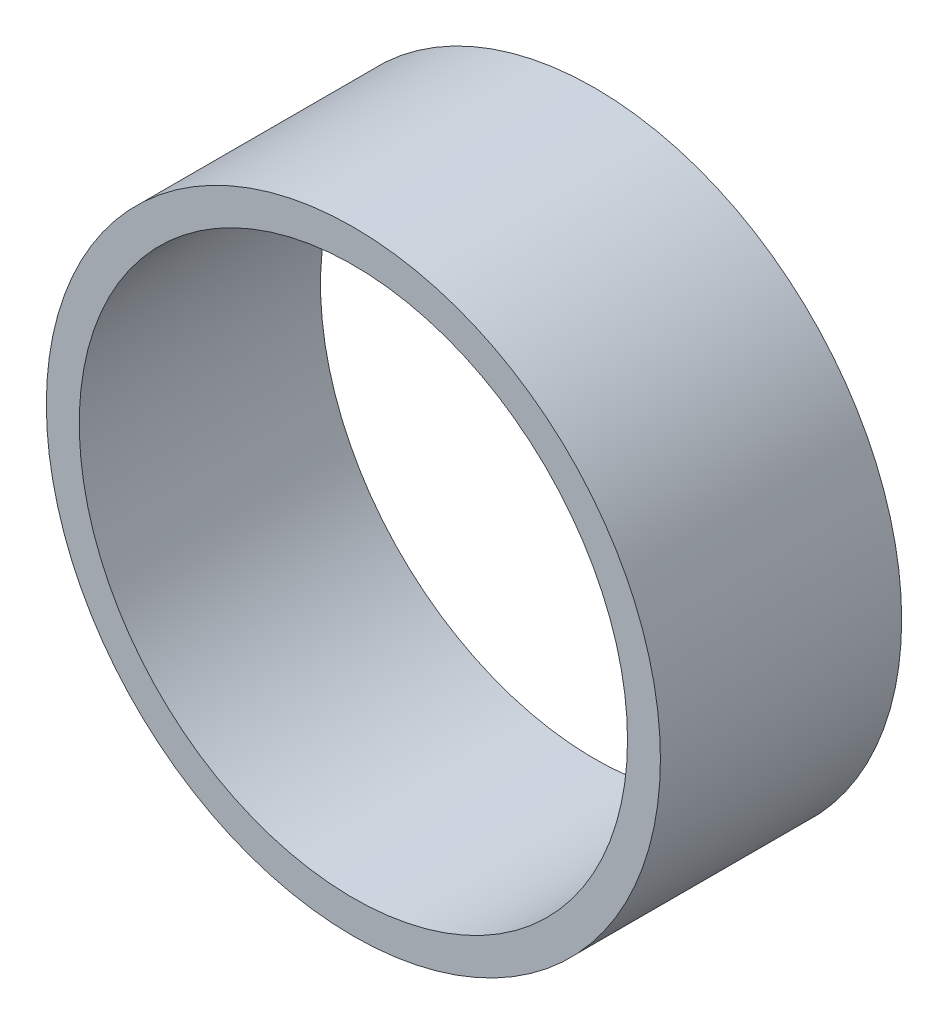
ISO-10303-21;
HEADER;
FILE_DESCRIPTION(('STEP AP214'),'2;1');
FILE_NAME('part.step','',(''),(''),'','','');
FILE_SCHEMA(('AUTOMOTIVE_DESIGN { 1 0 10303 214 1 1 1 1 }'));
ENDSEC;
DATA;
#1=APPLICATION_CONTEXT('core data for automotive mechanical design processes');
#2=APPLICATION_PROTOCOL_DEFINITION('international standard','automotive_design',2000,#1);
#3=PRODUCT_CONTEXT('',#1,'mechanical');
#4=PRODUCT('Part','Part','',(#3));
#5=PRODUCT_RELATED_PRODUCT_CATEGORY('part','',(#4));
#6=PRODUCT_DEFINITION_FORMATION('','',#4);
#7=PRODUCT_DEFINITION_CONTEXT('part definition',#1,'design');
#8=PRODUCT_DEFINITION('design','',#6,#7);
#9=PRODUCT_DEFINITION_SHAPE('','',#8);
#10=(LENGTH_UNIT() NAMED_UNIT(*) SI_UNIT(.MILLI.,.METRE.));
#11=(NAMED_UNIT(*) PLANE_ANGLE_UNIT() SI_UNIT($,.RADIAN.));
#12=(NAMED_UNIT(*) SI_UNIT($,.STERADIAN.) SOLID_ANGLE_UNIT());
#13=UNCERTAINTY_MEASURE_WITH_UNIT(LENGTH_MEASURE(1.E-05),#10,'distance_accuracy_value','');
#14=(GEOMETRIC_REPRESENTATION_CONTEXT(3) GLOBAL_UNCERTAINTY_ASSIGNED_CONTEXT((#13)) GLOBAL_UNIT_ASSIGNED_CONTEXT((#10,
#11,#12)) REPRESENTATION_CONTEXT('',''));
#15=CARTESIAN_POINT('',(0.,0.,0.));
#16=DIRECTION('',(0.,0.,1.));
#17=DIRECTION('',(1.,0.,0.));
#18=AXIS2_PLACEMENT_3D('',#15,#16,#17);
#19=CARTESIAN_POINT('',(0.,0.,22.));
#20=DIRECTION('',(0.,0.,1.));
#21=DIRECTION('',(1.,0.,0.));
#22=AXIS2_PLACEMENT_3D('',#19,#20,#21);
#23=PLANE('',#22);
#24=CARTESIAN_POINT('',(0.,0.,22.));
#25=DIRECTION('',(0.,0.,1.));
#26=DIRECTION('',(1.,0.,0.));
#27=AXIS2_PLACEMENT_3D('',#24,#25,#26);
#28=CIRCLE('',#27,28.);
#29=CARTESIAN_POINT('',(28.,0.,22.));
#30=VERTEX_POINT('',#29);
#31=EDGE_CURVE('E12',#30,#30,#28,.T.);
#32=ORIENTED_EDGE('',*,*,#31,.T.);
#33=EDGE_LOOP('',(#32));
#34=FACE_BOUND('',#33,.T.);
#35=CARTESIAN_POINT('',(0.,0.,22.));
#36=DIRECTION('',(0.,0.,1.));
#37=DIRECTION('',(1.,0.,0.));
#38=AXIS2_PLACEMENT_3D('',#35,#36,#37);
#39=CIRCLE('',#38,25.);
#40=CARTESIAN_POINT('',(25.,0.,22.));
#41=VERTEX_POINT('',#40);
#42=EDGE_CURVE('E56',#41,#41,#39,.T.);
#43=ORIENTED_EDGE('',*,*,#42,.F.);
#44=EDGE_LOOP('',(#43));
#45=FACE_BOUND('',#44,.T.);
#46=ADVANCED_FACE('F45',(#34,#45),#23,.T.);
#47=CARTESIAN_POINT('',(0.,0.,0.));
#48=DIRECTION('',(0.,0.,1.));
#49=DIRECTION('',(1.,0.,0.));
#50=AXIS2_PLACEMENT_3D('',#47,#48,#49);
#51=PLANE('',#50);
#52=CARTESIAN_POINT('',(0.,0.,0.));
#53=DIRECTION('',(0.,0.,1.));
#54=DIRECTION('',(1.,0.,0.));
#55=AXIS2_PLACEMENT_3D('',#52,#53,#54);
#56=CIRCLE('',#55,28.);
#57=CARTESIAN_POINT('',(28.,0.,0.));
#58=VERTEX_POINT('',#57);
#59=EDGE_CURVE('E49',#58,#58,#56,.T.);
#60=ORIENTED_EDGE('',*,*,#59,.F.);
#61=EDGE_LOOP('',(#60));
#62=FACE_BOUND('',#61,.T.);
#63=CARTESIAN_POINT('',(0.,0.,0.));
#64=DIRECTION('',(0.,0.,1.));
#65=DIRECTION('',(1.,0.,0.));
#66=AXIS2_PLACEMENT_3D('',#63,#64,#65);
#67=CIRCLE('',#66,25.);
#68=CARTESIAN_POINT('',(25.,0.,0.));
#69=VERTEX_POINT('',#68);
#70=EDGE_CURVE('E58',#69,#69,#67,.T.);
#71=ORIENTED_EDGE('',*,*,#70,.T.);
#72=EDGE_LOOP('',(#71));
#73=FACE_BOUND('',#72,.T.);
#74=ADVANCED_FACE('F68',(#62,#73),#51,.F.);
#75=CARTESIAN_POINT('',(0.,0.,22.));
#76=DIRECTION('',(0.,0.,-1.));
#77=DIRECTION('',(-1.,0.,0.));
#78=AXIS2_PLACEMENT_3D('',#75,#76,#77);
#79=CYLINDRICAL_SURFACE('',#78,28.);
#80=ORIENTED_EDGE('',*,*,#31,.F.);
#81=EDGE_LOOP('',(#80));
#82=FACE_BOUND('',#81,.T.);
#83=ORIENTED_EDGE('',*,*,#59,.T.);
#84=EDGE_LOOP('',(#83));
#85=FACE_BOUND('',#84,.T.);
#86=ADVANCED_FACE('F47',(#82,#85),#79,.T.);
#87=CARTESIAN_POINT('',(0.,0.,22.));
#88=DIRECTION('',(0.,0.,-1.));
#89=DIRECTION('',(-1.,0.,0.));
#90=AXIS2_PLACEMENT_3D('',#87,#88,#89);
#91=CYLINDRICAL_SURFACE('',#90,25.);
#92=ORIENTED_EDGE('',*,*,#42,.T.);
#93=EDGE_LOOP('',(#92));
#94=FACE_BOUND('',#93,.T.);
#95=ORIENTED_EDGE('',*,*,#70,.F.);
#96=EDGE_LOOP('',(#95));
#97=FACE_BOUND('',#96,.T.);
#98=ADVANCED_FACE('F64',(#94,#97),#91,.F.);
#99=CLOSED_SHELL('',(#46,#74,#86,#98));
#100=MANIFOLD_SOLID_BREP('B2',#99);
#101=ADVANCED_BREP_SHAPE_REPRESENTATION('',(#18,#100),#14);
#102=SHAPE_DEFINITION_REPRESENTATION(#9,#101);
ENDSEC;
END-ISO-10303-21;
